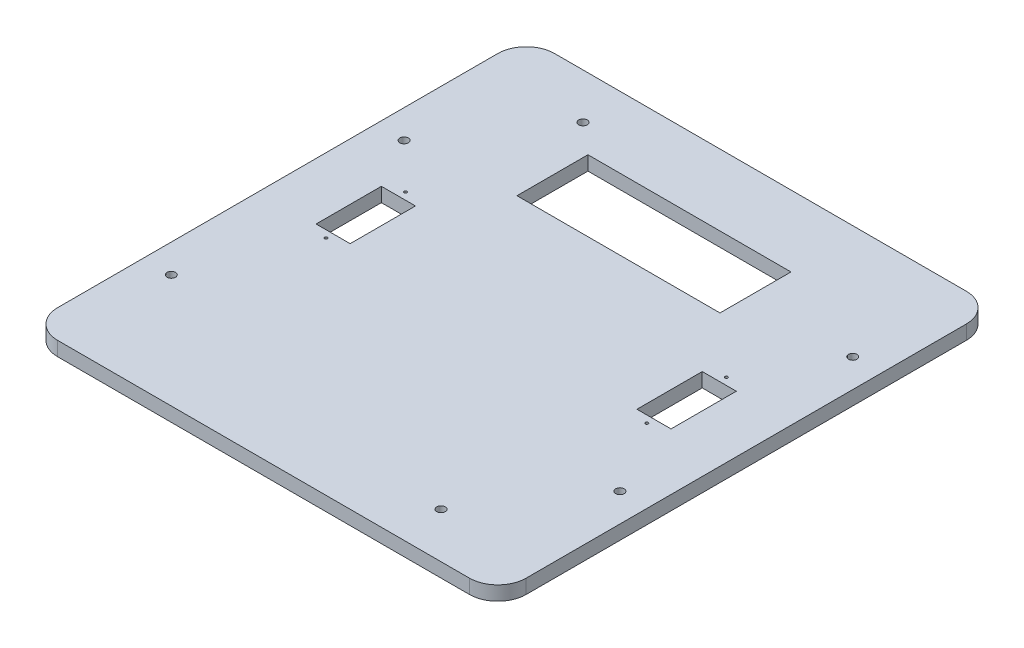
ISO-10303-21;
HEADER;
FILE_DESCRIPTION(('STEP AP214'),'2;1');
FILE_NAME('part.step','',(''),(''),'','','');
FILE_SCHEMA(('AUTOMOTIVE_DESIGN { 1 0 10303 214 1 1 1 1 }'));
ENDSEC;
DATA;
#1=APPLICATION_CONTEXT('core data for automotive mechanical design processes');
#2=APPLICATION_PROTOCOL_DEFINITION('international standard','automotive_design',2000,#1);
#3=PRODUCT_CONTEXT('',#1,'mechanical');
#4=PRODUCT('Part','Part','',(#3));
#5=PRODUCT_RELATED_PRODUCT_CATEGORY('part','',(#4));
#6=PRODUCT_DEFINITION_FORMATION('','',#4);
#7=PRODUCT_DEFINITION_CONTEXT('part definition',#1,'design');
#8=PRODUCT_DEFINITION('design','',#6,#7);
#9=PRODUCT_DEFINITION_SHAPE('','',#8);
#10=(LENGTH_UNIT() NAMED_UNIT(*) SI_UNIT(.MILLI.,.METRE.));
#11=(NAMED_UNIT(*) PLANE_ANGLE_UNIT() SI_UNIT($,.RADIAN.));
#12=(NAMED_UNIT(*) SI_UNIT($,.STERADIAN.) SOLID_ANGLE_UNIT());
#13=UNCERTAINTY_MEASURE_WITH_UNIT(LENGTH_MEASURE(1.E-05),#10,'distance_accuracy_value','');
#14=(GEOMETRIC_REPRESENTATION_CONTEXT(3) GLOBAL_UNCERTAINTY_ASSIGNED_CONTEXT((#13)) GLOBAL_UNIT_ASSIGNED_CONTEXT((#10,
#11,#12)) REPRESENTATION_CONTEXT('',''));
#15=CARTESIAN_POINT('',(0.,0.,0.));
#16=DIRECTION('',(0.,0.,1.));
#17=DIRECTION('',(1.,0.,0.));
#18=AXIS2_PLACEMENT_3D('',#15,#16,#17);
#19=CARTESIAN_POINT('',(0.,5.,-142.264378700801));
#20=DIRECTION('',(0.,0.,-1.));
#21=DIRECTION('',(-1.,0.,0.));
#22=AXIS2_PLACEMENT_3D('',#19,#20,#21);
#23=PLANE('',#22);
#24=DIRECTION('',(1.,0.,0.));
#25=VECTOR('',#24,1.);
#26=CARTESIAN_POINT('',(0.,0.,-142.264378700801));
#27=LINE('',#26,#25);
#28=CARTESIAN_POINT('',(-25.4635897407987,0.,-142.264378700801));
#29=VERTEX_POINT('',#28);
#30=CARTESIAN_POINT('',(119.536410259201,0.,-142.264378700801));
#31=VERTEX_POINT('',#30);
#32=EDGE_CURVE('E318',#29,#31,#27,.T.);
#33=ORIENTED_EDGE('',*,*,#32,.F.);
#34=DIRECTION('',(0.,-1.,0.));
#35=VECTOR('',#34,1.);
#36=CARTESIAN_POINT('',(-25.4635897407987,5.,-142.264378700801));
#37=LINE('',#36,#35);
#38=CARTESIAN_POINT('',(-25.4635897407987,5.,-142.264378700801));
#39=VERTEX_POINT('',#38);
#40=EDGE_CURVE('E11',#39,#29,#37,.T.);
#41=ORIENTED_EDGE('',*,*,#40,.F.);
#42=DIRECTION('',(1.,0.,0.));
#43=VECTOR('',#42,1.);
#44=CARTESIAN_POINT('',(0.,5.,-142.264378700801));
#45=LINE('',#44,#43);
#46=CARTESIAN_POINT('',(119.536410259201,5.,-142.264378700801));
#47=VERTEX_POINT('',#46);
#48=EDGE_CURVE('E321',#39,#47,#45,.T.);
#49=ORIENTED_EDGE('',*,*,#48,.T.);
#50=DIRECTION('',(0.,-1.,0.));
#51=VECTOR('',#50,1.);
#52=CARTESIAN_POINT('',(119.536410259201,5.,-142.264378700801));
#53=LINE('',#52,#51);
#54=EDGE_CURVE('E341',#47,#31,#53,.T.);
#55=ORIENTED_EDGE('',*,*,#54,.T.);
#56=EDGE_LOOP('',(#33,#41,#49,#55));
#57=FACE_BOUND('',#56,.T.);
#58=ADVANCED_FACE('F33',(#57),#23,.T.);
#59=CARTESIAN_POINT('',(-25.4635897407988,5.,-132.264378700801));
#60=DIRECTION('',(0.,-1.,0.));
#61=DIRECTION('',(0.,0.,-1.));
#62=AXIS2_PLACEMENT_3D('',#59,#60,#61);
#63=CYLINDRICAL_SURFACE('',#62,10.);
#64=CARTESIAN_POINT('',(-25.4635897407988,0.,-132.264378700801));
#65=DIRECTION('',(0.,1.,0.));
#66=DIRECTION('',(0.,0.,1.));
#67=AXIS2_PLACEMENT_3D('',#64,#65,#66);
#68=CIRCLE('',#67,10.);
#69=CARTESIAN_POINT('',(-35.4635897407988,0.,-132.264378700801));
#70=VERTEX_POINT('',#69);
#71=EDGE_CURVE('E344',#29,#70,#68,.T.);
#72=ORIENTED_EDGE('',*,*,#71,.T.);
#73=DIRECTION('',(0.,-1.,0.));
#74=VECTOR('',#73,1.);
#75=CARTESIAN_POINT('',(-35.4635897407988,5.,-132.264378700801));
#76=LINE('',#75,#74);
#77=CARTESIAN_POINT('',(-35.4635897407988,5.,-132.264378700801));
#78=VERTEX_POINT('',#77);
#79=EDGE_CURVE('E40',#78,#70,#76,.T.);
#80=ORIENTED_EDGE('',*,*,#79,.F.);
#81=CARTESIAN_POINT('',(-25.4635897407988,5.,-132.264378700801));
#82=DIRECTION('',(0.,1.,0.));
#83=DIRECTION('',(0.,0.,1.));
#84=AXIS2_PLACEMENT_3D('',#81,#82,#83);
#85=CIRCLE('',#84,10.);
#86=EDGE_CURVE('E324',#39,#78,#85,.T.);
#87=ORIENTED_EDGE('',*,*,#86,.F.);
#88=ORIENTED_EDGE('',*,*,#40,.T.);
#89=EDGE_LOOP('',(#72,#80,#87,#88));
#90=FACE_BOUND('',#89,.T.);
#91=ADVANCED_FACE('F403',(#90),#63,.T.);
#92=CARTESIAN_POINT('',(-35.4635897407988,5.,0.));
#93=DIRECTION('',(1.,0.,0.));
#94=DIRECTION('',(0.,0.,-1.));
#95=AXIS2_PLACEMENT_3D('',#92,#93,#94);
#96=PLANE('',#95);
#97=DIRECTION('',(0.,0.,1.));
#98=VECTOR('',#97,1.);
#99=CARTESIAN_POINT('',(-35.4635897407988,0.,0.));
#100=LINE('',#99,#98);
#101=CARTESIAN_POINT('',(-35.4635897407988,0.,22.7356212991988));
#102=VERTEX_POINT('',#101);
#103=EDGE_CURVE('E346',#70,#102,#100,.T.);
#104=ORIENTED_EDGE('',*,*,#103,.T.);
#105=DIRECTION('',(0.,-1.,0.));
#106=VECTOR('',#105,1.);
#107=CARTESIAN_POINT('',(-35.4635897407988,5.,22.7356212991988));
#108=LINE('',#107,#106);
#109=CARTESIAN_POINT('',(-35.4635897407988,5.,22.7356212991988));
#110=VERTEX_POINT('',#109);
#111=EDGE_CURVE('E371',#110,#102,#108,.T.);
#112=ORIENTED_EDGE('',*,*,#111,.F.);
#113=DIRECTION('',(0.,0.,1.));
#114=VECTOR('',#113,1.);
#115=CARTESIAN_POINT('',(-35.4635897407988,5.,0.));
#116=LINE('',#115,#114);
#117=EDGE_CURVE('E327',#78,#110,#116,.T.);
#118=ORIENTED_EDGE('',*,*,#117,.F.);
#119=ORIENTED_EDGE('',*,*,#79,.T.);
#120=EDGE_LOOP('',(#104,#112,#118,#119));
#121=FACE_BOUND('',#120,.T.);
#122=ADVANCED_FACE('F378',(#121),#96,.F.);
#123=CARTESIAN_POINT('',(-25.4635897407988,5.,22.7356212991989));
#124=DIRECTION('',(0.,-1.,0.));
#125=DIRECTION('',(0.,0.,-1.));
#126=AXIS2_PLACEMENT_3D('',#123,#124,#125);
#127=CYLINDRICAL_SURFACE('',#126,10.);
#128=CARTESIAN_POINT('',(-25.4635897407988,0.,22.7356212991989));
#129=DIRECTION('',(0.,1.,0.));
#130=DIRECTION('',(0.,0.,1.));
#131=AXIS2_PLACEMENT_3D('',#128,#129,#130);
#132=CIRCLE('',#131,10.);
#133=CARTESIAN_POINT('',(-25.4635897407987,0.,32.7356212991989));
#134=VERTEX_POINT('',#133);
#135=EDGE_CURVE('E348',#102,#134,#132,.T.);
#136=ORIENTED_EDGE('',*,*,#135,.T.);
#137=DIRECTION('',(0.,-1.,0.));
#138=VECTOR('',#137,1.);
#139=CARTESIAN_POINT('',(-25.4635897407987,5.,32.7356212991989));
#140=LINE('',#139,#138);
#141=CARTESIAN_POINT('',(-25.4635897407987,5.,32.7356212991989));
#142=VERTEX_POINT('',#141);
#143=EDGE_CURVE('E368',#142,#134,#140,.T.);
#144=ORIENTED_EDGE('',*,*,#143,.F.);
#145=CARTESIAN_POINT('',(-25.4635897407988,5.,22.7356212991989));
#146=DIRECTION('',(0.,1.,0.));
#147=DIRECTION('',(0.,0.,1.));
#148=AXIS2_PLACEMENT_3D('',#145,#146,#147);
#149=CIRCLE('',#148,10.);
#150=EDGE_CURVE('E329',#110,#142,#149,.T.);
#151=ORIENTED_EDGE('',*,*,#150,.F.);
#152=ORIENTED_EDGE('',*,*,#111,.T.);
#153=EDGE_LOOP('',(#136,#144,#151,#152));
#154=FACE_BOUND('',#153,.T.);
#155=ADVANCED_FACE('F390',(#154),#127,.T.);
#156=CARTESIAN_POINT('',(0.,5.,32.7356212991989));
#157=DIRECTION('',(0.,0.,-1.));
#158=DIRECTION('',(-1.,0.,0.));
#159=AXIS2_PLACEMENT_3D('',#156,#157,#158);
#160=PLANE('',#159);
#161=DIRECTION('',(1.,0.,0.));
#162=VECTOR('',#161,1.);
#163=CARTESIAN_POINT('',(0.,0.,32.7356212991989));
#164=LINE('',#163,#162);
#165=CARTESIAN_POINT('',(119.536410259201,0.,32.7356212991989));
#166=VERTEX_POINT('',#165);
#167=EDGE_CURVE('E350',#134,#166,#164,.T.);
#168=ORIENTED_EDGE('',*,*,#167,.T.);
#169=DIRECTION('',(0.,-1.,0.));
#170=VECTOR('',#169,1.);
#171=CARTESIAN_POINT('',(119.536410259201,5.,32.7356212991989));
#172=LINE('',#171,#170);
#173=CARTESIAN_POINT('',(119.536410259201,5.,32.7356212991989));
#174=VERTEX_POINT('',#173);
#175=EDGE_CURVE('E365',#174,#166,#172,.T.);
#176=ORIENTED_EDGE('',*,*,#175,.F.);
#177=DIRECTION('',(1.,0.,0.));
#178=VECTOR('',#177,1.);
#179=CARTESIAN_POINT('',(0.,5.,32.7356212991989));
#180=LINE('',#179,#178);
#181=EDGE_CURVE('E331',#142,#174,#180,.T.);
#182=ORIENTED_EDGE('',*,*,#181,.F.);
#183=ORIENTED_EDGE('',*,*,#143,.T.);
#184=EDGE_LOOP('',(#168,#176,#182,#183));
#185=FACE_BOUND('',#184,.T.);
#186=ADVANCED_FACE('F394',(#185),#160,.F.);
#187=CARTESIAN_POINT('',(119.536410259201,5.,22.7356212991989));
#188=DIRECTION('',(0.,-1.,0.));
#189=DIRECTION('',(0.,0.,-1.));
#190=AXIS2_PLACEMENT_3D('',#187,#188,#189);
#191=CYLINDRICAL_SURFACE('',#190,10.);
#192=CARTESIAN_POINT('',(119.536410259201,0.,22.7356212991989));
#193=DIRECTION('',(0.,1.,0.));
#194=DIRECTION('',(0.,0.,1.));
#195=AXIS2_PLACEMENT_3D('',#192,#193,#194);
#196=CIRCLE('',#195,10.);
#197=CARTESIAN_POINT('',(129.536410259201,0.,22.7356212991988));
#198=VERTEX_POINT('',#197);
#199=EDGE_CURVE('E352',#166,#198,#196,.T.);
#200=ORIENTED_EDGE('',*,*,#199,.T.);
#201=DIRECTION('',(0.,-1.,0.));
#202=VECTOR('',#201,1.);
#203=CARTESIAN_POINT('',(129.536410259201,5.,22.7356212991988));
#204=LINE('',#203,#202);
#205=CARTESIAN_POINT('',(129.536410259201,5.,22.7356212991988));
#206=VERTEX_POINT('',#205);
#207=EDGE_CURVE('E363',#206,#198,#204,.T.);
#208=ORIENTED_EDGE('',*,*,#207,.F.);
#209=CARTESIAN_POINT('',(119.536410259201,5.,22.7356212991989));
#210=DIRECTION('',(0.,1.,0.));
#211=DIRECTION('',(0.,0.,1.));
#212=AXIS2_PLACEMENT_3D('',#209,#210,#211);
#213=CIRCLE('',#212,10.);
#214=EDGE_CURVE('E333',#174,#206,#213,.T.);
#215=ORIENTED_EDGE('',*,*,#214,.F.);
#216=ORIENTED_EDGE('',*,*,#175,.T.);
#217=EDGE_LOOP('',(#200,#208,#215,#216));
#218=FACE_BOUND('',#217,.T.);
#219=ADVANCED_FACE('F412',(#218),#191,.T.);
#220=CARTESIAN_POINT('',(129.536410259201,5.,0.));
#221=DIRECTION('',(1.,0.,0.));
#222=DIRECTION('',(0.,0.,-1.));
#223=AXIS2_PLACEMENT_3D('',#220,#221,#222);
#224=PLANE('',#223);
#225=DIRECTION('',(0.,0.,1.));
#226=VECTOR('',#225,1.);
#227=CARTESIAN_POINT('',(129.536410259201,0.,0.));
#228=LINE('',#227,#226);
#229=CARTESIAN_POINT('',(129.536410259201,0.,-132.264378700801));
#230=VERTEX_POINT('',#229);
#231=EDGE_CURVE('E355',#230,#198,#228,.T.);
#232=ORIENTED_EDGE('',*,*,#231,.F.);
#233=DIRECTION('',(0.,-1.,0.));
#234=VECTOR('',#233,1.);
#235=CARTESIAN_POINT('',(129.536410259201,5.,-132.264378700801));
#236=LINE('',#235,#234);
#237=CARTESIAN_POINT('',(129.536410259201,5.,-132.264378700801));
#238=VERTEX_POINT('',#237);
#239=EDGE_CURVE('E361',#238,#230,#236,.T.);
#240=ORIENTED_EDGE('',*,*,#239,.F.);
#241=DIRECTION('',(0.,0.,1.));
#242=VECTOR('',#241,1.);
#243=CARTESIAN_POINT('',(129.536410259201,5.,0.));
#244=LINE('',#243,#242);
#245=EDGE_CURVE('E335',#238,#206,#244,.T.);
#246=ORIENTED_EDGE('',*,*,#245,.T.);
#247=ORIENTED_EDGE('',*,*,#207,.T.);
#248=EDGE_LOOP('',(#232,#240,#246,#247));
#249=FACE_BOUND('',#248,.T.);
#250=ADVANCED_FACE('F410',(#249),#224,.T.);
#251=CARTESIAN_POINT('',(119.536410259201,5.,-132.264378700801));
#252=DIRECTION('',(0.,-1.,0.));
#253=DIRECTION('',(0.,0.,-1.));
#254=AXIS2_PLACEMENT_3D('',#251,#252,#253);
#255=CYLINDRICAL_SURFACE('',#254,10.);
#256=CARTESIAN_POINT('',(119.536410259201,0.,-132.264378700801));
#257=DIRECTION('',(0.,1.,0.));
#258=DIRECTION('',(0.,0.,1.));
#259=AXIS2_PLACEMENT_3D('',#256,#257,#258);
#260=CIRCLE('',#259,10.);
#261=EDGE_CURVE('E325',#31,#230,#260,.F.);
#262=ORIENTED_EDGE('',*,*,#261,.F.);
#263=ORIENTED_EDGE('',*,*,#54,.F.);
#264=CARTESIAN_POINT('',(119.536410259201,5.,-132.264378700801));
#265=DIRECTION('',(0.,1.,0.));
#266=DIRECTION('',(0.,0.,1.));
#267=AXIS2_PLACEMENT_3D('',#264,#265,#266);
#268=CIRCLE('',#267,10.);
#269=EDGE_CURVE('E338',#47,#238,#268,.F.);
#270=ORIENTED_EDGE('',*,*,#269,.T.);
#271=ORIENTED_EDGE('',*,*,#239,.T.);
#272=EDGE_LOOP('',(#262,#263,#270,#271));
#273=FACE_BOUND('',#272,.T.);
#274=ADVANCED_FACE('F407',(#273),#255,.T.);
#275=CARTESIAN_POINT('',(0.,5.,0.));
#276=DIRECTION('',(0.,1.,0.));
#277=DIRECTION('',(0.,0.,1.));
#278=AXIS2_PLACEMENT_3D('',#275,#276,#277);
#279=PLANE('',#278);
#280=CARTESIAN_POINT('',(-25.4635897407988,5.,-89.2643787008011));
#281=DIRECTION('',(0.,1.,0.));
#282=DIRECTION('',(0.,0.,1.));
#283=AXIS2_PLACEMENT_3D('',#280,#281,#282);
#284=CIRCLE('',#283,1.5);
#285=CARTESIAN_POINT('',(-25.4635897407988,5.,-87.7643787008011));
#286=VERTEX_POINT('',#285);
#287=EDGE_CURVE('E700',#286,#286,#284,.T.);
#288=ORIENTED_EDGE('',*,*,#287,.F.);
#289=EDGE_LOOP('',(#288));
#290=FACE_BOUND('',#289,.T.);
#291=CARTESIAN_POINT('',(119.536410259201,5.,-20.2643787008011));
#292=DIRECTION('',(0.,1.,0.));
#293=DIRECTION('',(0.,0.,1.));
#294=AXIS2_PLACEMENT_3D('',#291,#292,#293);
#295=CIRCLE('',#294,1.5);
#296=CARTESIAN_POINT('',(119.536410259201,5.,-18.7643787008011));
#297=VERTEX_POINT('',#296);
#298=EDGE_CURVE('E192',#297,#297,#295,.T.);
#299=ORIENTED_EDGE('',*,*,#298,.F.);
#300=EDGE_LOOP('',(#299));
#301=FACE_BOUND('',#300,.T.);
#302=DIRECTION('',(0.,0.,1.));
#303=VECTOR('',#302,1.);
#304=CARTESIAN_POINT('',(11.2864102592012,5.,-92.2643787008011));
#305=LINE('',#304,#303);
#306=CARTESIAN_POINT('',(11.2864102592012,5.,-117.264378700801));
#307=VERTEX_POINT('',#306);
#308=CARTESIAN_POINT('',(11.2864102592012,5.,-92.2643787008011));
#309=VERTEX_POINT('',#308);
#310=EDGE_CURVE('E47',#307,#309,#305,.T.);
#311=ORIENTED_EDGE('',*,*,#310,.F.);
#312=DIRECTION('',(-1.,0.,0.));
#313=VECTOR('',#312,1.);
#314=CARTESIAN_POINT('',(11.2864102592012,5.,-117.264378700801));
#315=LINE('',#314,#313);
#316=CARTESIAN_POINT('',(82.7864102592012,5.,-117.264378700801));
#317=VERTEX_POINT('',#316);
#318=EDGE_CURVE('E186',#317,#307,#315,.T.);
#319=ORIENTED_EDGE('',*,*,#318,.F.);
#320=DIRECTION('',(0.,0.,-1.));
#321=VECTOR('',#320,1.);
#322=CARTESIAN_POINT('',(82.7864102592012,5.,-92.2643787008011));
#323=LINE('',#322,#321);
#324=CARTESIAN_POINT('',(82.7864102592012,5.,-92.2643787008011));
#325=VERTEX_POINT('',#324);
#326=EDGE_CURVE('E189',#325,#317,#323,.T.);
#327=ORIENTED_EDGE('',*,*,#326,.F.);
#328=DIRECTION('',(1.,0.,0.));
#329=VECTOR('',#328,1.);
#330=CARTESIAN_POINT('',(11.2864102592012,5.,-92.2643787008011));
#331=LINE('',#330,#329);
#332=EDGE_CURVE('E198',#309,#325,#331,.T.);
#333=ORIENTED_EDGE('',*,*,#332,.F.);
#334=EDGE_LOOP('',(#311,#319,#327,#333));
#335=FACE_BOUND('',#334,.T.);
#336=DIRECTION('',(0.,0.,1.));
#337=VECTOR('',#336,1.);
#338=CARTESIAN_POINT('',(-15.4635897407988,5.,-48.2643787008011));
#339=LINE('',#338,#337);
#340=CARTESIAN_POINT('',(-15.4635897407988,5.,-71.2643787008011));
#341=VERTEX_POINT('',#340);
#342=CARTESIAN_POINT('',(-15.4635897407988,5.,-48.2643787008011));
#343=VERTEX_POINT('',#342);
#344=EDGE_CURVE('E205',#341,#343,#339,.T.);
#345=ORIENTED_EDGE('',*,*,#344,.F.);
#346=DIRECTION('',(-1.,0.,0.));
#347=VECTOR('',#346,1.);
#348=CARTESIAN_POINT('',(-15.4635897407988,5.,-71.2643787008011));
#349=LINE('',#348,#347);
#350=CARTESIAN_POINT('',(-3.46358974079879,5.,-71.2643787008011));
#351=VERTEX_POINT('',#350);
#352=EDGE_CURVE('E253',#351,#341,#349,.T.);
#353=ORIENTED_EDGE('',*,*,#352,.F.);
#354=DIRECTION('',(0.,0.,-1.));
#355=VECTOR('',#354,1.);
#356=CARTESIAN_POINT('',(-3.46358974079879,5.,-48.2643787008011));
#357=LINE('',#356,#355);
#358=CARTESIAN_POINT('',(-3.46358974079879,5.,-48.2643787008011));
#359=VERTEX_POINT('',#358);
#360=EDGE_CURVE('E267',#359,#351,#357,.T.);
#361=ORIENTED_EDGE('',*,*,#360,.F.);
#362=DIRECTION('',(1.,0.,0.));
#363=VECTOR('',#362,1.);
#364=CARTESIAN_POINT('',(-15.4635897407988,5.,-48.2643787008011));
#365=LINE('',#364,#363);
#366=EDGE_CURVE('E264',#343,#359,#365,.T.);
#367=ORIENTED_EDGE('',*,*,#366,.F.);
#368=EDGE_LOOP('',(#345,#353,#361,#367));
#369=FACE_BOUND('',#368,.T.);
#370=DIRECTION('',(0.,0.,-1.));
#371=VECTOR('',#370,1.);
#372=CARTESIAN_POINT('',(109.536410259201,5.,-48.2643787008011));
#373=LINE('',#372,#371);
#374=CARTESIAN_POINT('',(109.536410259201,5.,-48.2643787008011));
#375=VERTEX_POINT('',#374);
#376=CARTESIAN_POINT('',(109.536410259201,5.,-71.2643787008011));
#377=VERTEX_POINT('',#376);
#378=EDGE_CURVE('E231',#375,#377,#373,.T.);
#379=ORIENTED_EDGE('',*,*,#378,.F.);
#380=DIRECTION('',(1.,0.,0.));
#381=VECTOR('',#380,1.);
#382=CARTESIAN_POINT('',(109.536410259201,5.,-48.2643787008011));
#383=LINE('',#382,#381);
#384=CARTESIAN_POINT('',(97.5364102592012,5.,-48.2643787008011));
#385=VERTEX_POINT('',#384);
#386=EDGE_CURVE('E221',#385,#375,#383,.T.);
#387=ORIENTED_EDGE('',*,*,#386,.F.);
#388=DIRECTION('',(0.,0.,1.));
#389=VECTOR('',#388,1.);
#390=CARTESIAN_POINT('',(97.5364102592012,5.,-48.2643787008011));
#391=LINE('',#390,#389);
#392=CARTESIAN_POINT('',(97.5364102592012,5.,-71.2643787008011));
#393=VERTEX_POINT('',#392);
#394=EDGE_CURVE('E237',#393,#385,#391,.T.);
#395=ORIENTED_EDGE('',*,*,#394,.F.);
#396=DIRECTION('',(-1.,0.,0.));
#397=VECTOR('',#396,1.);
#398=CARTESIAN_POINT('',(109.536410259201,5.,-71.2643787008011));
#399=LINE('',#398,#397);
#400=EDGE_CURVE('E233',#377,#393,#399,.T.);
#401=ORIENTED_EDGE('',*,*,#400,.F.);
#402=EDGE_LOOP('',(#379,#387,#395,#401));
#403=FACE_BOUND('',#402,.T.);
#404=CARTESIAN_POINT('',(103.536410259201,5.,-73.7643787008011));
#405=DIRECTION('',(0.,1.,0.));
#406=DIRECTION('',(0.,0.,1.));
#407=AXIS2_PLACEMENT_3D('',#404,#405,#406);
#408=CIRCLE('',#407,0.499999999999999);
#409=CARTESIAN_POINT('',(103.536410259201,5.,-73.2643787008011));
#410=VERTEX_POINT('',#409);
#411=EDGE_CURVE('E213',#410,#410,#408,.T.);
#412=ORIENTED_EDGE('',*,*,#411,.F.);
#413=EDGE_LOOP('',(#412));
#414=FACE_BOUND('',#413,.T.);
#415=CARTESIAN_POINT('',(103.536410259201,5.,-45.7643787008011));
#416=DIRECTION('',(0.,1.,0.));
#417=DIRECTION('',(0.,0.,1.));
#418=AXIS2_PLACEMENT_3D('',#415,#416,#417);
#419=CIRCLE('',#418,0.499999999999999);
#420=CARTESIAN_POINT('',(103.536410259201,5.,-45.2643787008011));
#421=VERTEX_POINT('',#420);
#422=EDGE_CURVE('E212',#421,#421,#419,.T.);
#423=ORIENTED_EDGE('',*,*,#422,.F.);
#424=EDGE_LOOP('',(#423));
#425=FACE_BOUND('',#424,.T.);
#426=CARTESIAN_POINT('',(-9.46358974079879,5.,-73.7643787008011));
#427=DIRECTION('',(0.,1.,0.));
#428=DIRECTION('',(0.,0.,1.));
#429=AXIS2_PLACEMENT_3D('',#426,#427,#428);
#430=CIRCLE('',#429,0.499999999999999);
#431=CARTESIAN_POINT('',(-9.46358974079879,5.,-73.2643787008011));
#432=VERTEX_POINT('',#431);
#433=EDGE_CURVE('E283',#432,#432,#430,.T.);
#434=ORIENTED_EDGE('',*,*,#433,.F.);
#435=EDGE_LOOP('',(#434));
#436=FACE_BOUND('',#435,.T.);
#437=CARTESIAN_POINT('',(-9.46358974079879,5.,-45.7643787008011));
#438=DIRECTION('',(0.,1.,0.));
#439=DIRECTION('',(0.,0.,1.));
#440=AXIS2_PLACEMENT_3D('',#437,#438,#439);
#441=CIRCLE('',#440,0.499999999999999);
#442=CARTESIAN_POINT('',(-9.46358974079879,5.,-45.2643787008011));
#443=VERTEX_POINT('',#442);
#444=EDGE_CURVE('E282',#443,#443,#441,.T.);
#445=ORIENTED_EDGE('',*,*,#444,.F.);
#446=EDGE_LOOP('',(#445));
#447=FACE_BOUND('',#446,.T.);
#448=CARTESIAN_POINT('',(0.53641025920121,5.,-126.264378700801));
#449=DIRECTION('',(0.,1.,0.));
#450=DIRECTION('',(0.,0.,1.));
#451=AXIS2_PLACEMENT_3D('',#448,#449,#450);
#452=CIRCLE('',#451,1.5);
#453=CARTESIAN_POINT('',(0.53641025920121,5.,-124.764378700801));
#454=VERTEX_POINT('',#453);
#455=EDGE_CURVE('E301',#454,#454,#452,.T.);
#456=ORIENTED_EDGE('',*,*,#455,.F.);
#457=EDGE_LOOP('',(#456));
#458=FACE_BOUND('',#457,.T.);
#459=CARTESIAN_POINT('',(119.536410259201,5.,-102.264378700801));
#460=DIRECTION('',(0.,1.,0.));
#461=DIRECTION('',(0.,0.,1.));
#462=AXIS2_PLACEMENT_3D('',#459,#460,#461);
#463=CIRCLE('',#462,1.5);
#464=CARTESIAN_POINT('',(119.536410259201,5.,-100.764378700801));
#465=VERTEX_POINT('',#464);
#466=EDGE_CURVE('E307',#465,#465,#463,.T.);
#467=ORIENTED_EDGE('',*,*,#466,.F.);
#468=EDGE_LOOP('',(#467));
#469=FACE_BOUND('',#468,.T.);
#470=CARTESIAN_POINT('',(93.5364102592012,5.,16.7356212991989));
#471=DIRECTION('',(0.,1.,0.));
#472=DIRECTION('',(0.,0.,1.));
#473=AXIS2_PLACEMENT_3D('',#470,#471,#472);
#474=CIRCLE('',#473,1.5);
#475=CARTESIAN_POINT('',(93.5364102592012,5.,18.2356212991989));
#476=VERTEX_POINT('',#475);
#477=EDGE_CURVE('E294',#476,#476,#474,.T.);
#478=ORIENTED_EDGE('',*,*,#477,.F.);
#479=EDGE_LOOP('',(#478));
#480=FACE_BOUND('',#479,.T.);
#481=CARTESIAN_POINT('',(-25.4635897407988,5.,-7.2643787008011));
#482=DIRECTION('',(0.,1.,0.));
#483=DIRECTION('',(0.,0.,1.));
#484=AXIS2_PLACEMENT_3D('',#481,#482,#483);
#485=CIRCLE('',#484,1.5);
#486=CARTESIAN_POINT('',(-25.4635897407988,5.,-5.7643787008011));
#487=VERTEX_POINT('',#486);
#488=EDGE_CURVE('E300',#487,#487,#485,.T.);
#489=ORIENTED_EDGE('',*,*,#488,.F.);
#490=EDGE_LOOP('',(#489));
#491=FACE_BOUND('',#490,.T.);
#492=ORIENTED_EDGE('',*,*,#48,.F.);
#493=ORIENTED_EDGE('',*,*,#86,.T.);
#494=ORIENTED_EDGE('',*,*,#117,.T.);
#495=ORIENTED_EDGE('',*,*,#150,.T.);
#496=ORIENTED_EDGE('',*,*,#181,.T.);
#497=ORIENTED_EDGE('',*,*,#214,.T.);
#498=ORIENTED_EDGE('',*,*,#245,.F.);
#499=ORIENTED_EDGE('',*,*,#269,.F.);
#500=EDGE_LOOP('',(#492,#493,#494,#495,#496,#497,#498,#499));
#501=FACE_BOUND('',#500,.T.);
#502=ADVANCED_FACE('F399',(#290,#301,#335,#369,#403,#414,#425,#436,#447,#458,#469,#480,#491,
#501),#279,.T.);
#503=CARTESIAN_POINT('',(0.,0.,0.));
#504=DIRECTION('',(0.,1.,0.));
#505=DIRECTION('',(0.,0.,1.));
#506=AXIS2_PLACEMENT_3D('',#503,#504,#505);
#507=PLANE('',#506);
#508=CARTESIAN_POINT('',(-25.4635897407988,0.,-89.2643787008011));
#509=DIRECTION('',(0.,1.,0.));
#510=DIRECTION('',(0.,0.,1.));
#511=AXIS2_PLACEMENT_3D('',#508,#509,#510);
#512=CIRCLE('',#511,1.5);
#513=CARTESIAN_POINT('',(-25.4635897407988,0.,-87.7643787008011));
#514=VERTEX_POINT('',#513);
#515=EDGE_CURVE('E199',#514,#514,#512,.T.);
#516=ORIENTED_EDGE('',*,*,#515,.T.);
#517=EDGE_LOOP('',(#516));
#518=FACE_BOUND('',#517,.T.);
#519=CARTESIAN_POINT('',(119.536410259201,0.,-20.2643787008011));
#520=DIRECTION('',(0.,1.,0.));
#521=DIRECTION('',(0.,0.,1.));
#522=AXIS2_PLACEMENT_3D('',#519,#520,#521);
#523=CIRCLE('',#522,1.5);
#524=CARTESIAN_POINT('',(119.536410259201,0.,-18.7643787008011));
#525=VERTEX_POINT('',#524);
#526=EDGE_CURVE('E701',#525,#525,#523,.T.);
#527=ORIENTED_EDGE('',*,*,#526,.T.);
#528=EDGE_LOOP('',(#527));
#529=FACE_BOUND('',#528,.T.);
#530=DIRECTION('',(-1.,0.,0.));
#531=VECTOR('',#530,1.);
#532=CARTESIAN_POINT('',(11.2864102592012,0.,-117.264378700801));
#533=LINE('',#532,#531);
#534=CARTESIAN_POINT('',(82.7864102592012,0.,-117.264378700801));
#535=VERTEX_POINT('',#534);
#536=CARTESIAN_POINT('',(11.2864102592012,0.,-117.264378700801));
#537=VERTEX_POINT('',#536);
#538=EDGE_CURVE('E176',#535,#537,#533,.T.);
#539=ORIENTED_EDGE('',*,*,#538,.T.);
#540=DIRECTION('',(0.,0.,1.));
#541=VECTOR('',#540,1.);
#542=CARTESIAN_POINT('',(11.2864102592012,0.,-92.2643787008011));
#543=LINE('',#542,#541);
#544=CARTESIAN_POINT('',(11.2864102592012,0.,-92.2643787008011));
#545=VERTEX_POINT('',#544);
#546=EDGE_CURVE('E170',#537,#545,#543,.T.);
#547=ORIENTED_EDGE('',*,*,#546,.T.);
#548=DIRECTION('',(1.,0.,0.));
#549=VECTOR('',#548,1.);
#550=CARTESIAN_POINT('',(11.2864102592012,0.,-92.2643787008011));
#551=LINE('',#550,#549);
#552=CARTESIAN_POINT('',(82.7864102592012,0.,-92.2643787008011));
#553=VERTEX_POINT('',#552);
#554=EDGE_CURVE('E179',#545,#553,#551,.T.);
#555=ORIENTED_EDGE('',*,*,#554,.T.);
#556=DIRECTION('',(0.,0.,-1.));
#557=VECTOR('',#556,1.);
#558=CARTESIAN_POINT('',(82.7864102592012,0.,-92.2643787008011));
#559=LINE('',#558,#557);
#560=EDGE_CURVE('E55',#553,#535,#559,.T.);
#561=ORIENTED_EDGE('',*,*,#560,.T.);
#562=EDGE_LOOP('',(#539,#547,#555,#561));
#563=FACE_BOUND('',#562,.T.);
#564=DIRECTION('',(-1.,0.,0.));
#565=VECTOR('',#564,1.);
#566=CARTESIAN_POINT('',(-15.4635897407988,0.,-71.2643787008011));
#567=LINE('',#566,#565);
#568=CARTESIAN_POINT('',(-3.46358974079879,0.,-71.2643787008011));
#569=VERTEX_POINT('',#568);
#570=CARTESIAN_POINT('',(-15.4635897407988,0.,-71.2643787008011));
#571=VERTEX_POINT('',#570);
#572=EDGE_CURVE('E259',#569,#571,#567,.T.);
#573=ORIENTED_EDGE('',*,*,#572,.T.);
#574=DIRECTION('',(0.,0.,1.));
#575=VECTOR('',#574,1.);
#576=CARTESIAN_POINT('',(-15.4635897407988,0.,-48.2643787008011));
#577=LINE('',#576,#575);
#578=CARTESIAN_POINT('',(-15.4635897407988,0.,-48.2643787008011));
#579=VERTEX_POINT('',#578);
#580=EDGE_CURVE('E249',#571,#579,#577,.T.);
#581=ORIENTED_EDGE('',*,*,#580,.T.);
#582=DIRECTION('',(1.,0.,0.));
#583=VECTOR('',#582,1.);
#584=CARTESIAN_POINT('',(-15.4635897407988,0.,-48.2643787008011));
#585=LINE('',#584,#583);
#586=CARTESIAN_POINT('',(-3.46358974079879,0.,-48.2643787008011));
#587=VERTEX_POINT('',#586);
#588=EDGE_CURVE('E252',#579,#587,#585,.T.);
#589=ORIENTED_EDGE('',*,*,#588,.T.);
#590=DIRECTION('',(0.,0.,-1.));
#591=VECTOR('',#590,1.);
#592=CARTESIAN_POINT('',(-3.46358974079879,0.,-48.2643787008011));
#593=LINE('',#592,#591);
#594=EDGE_CURVE('E256',#587,#569,#593,.T.);
#595=ORIENTED_EDGE('',*,*,#594,.T.);
#596=EDGE_LOOP('',(#573,#581,#589,#595));
#597=FACE_BOUND('',#596,.T.);
#598=DIRECTION('',(1.,0.,0.));
#599=VECTOR('',#598,1.);
#600=CARTESIAN_POINT('',(109.536410259201,0.,-48.2643787008011));
#601=LINE('',#600,#599);
#602=CARTESIAN_POINT('',(97.5364102592012,0.,-48.2643787008011));
#603=VERTEX_POINT('',#602);
#604=CARTESIAN_POINT('',(109.536410259201,0.,-48.2643787008011));
#605=VERTEX_POINT('',#604);
#606=EDGE_CURVE('E227',#603,#605,#601,.T.);
#607=ORIENTED_EDGE('',*,*,#606,.T.);
#608=DIRECTION('',(0.,0.,-1.));
#609=VECTOR('',#608,1.);
#610=CARTESIAN_POINT('',(109.536410259201,0.,-48.2643787008011));
#611=LINE('',#610,#609);
#612=CARTESIAN_POINT('',(109.536410259201,0.,-71.2643787008011));
#613=VERTEX_POINT('',#612);
#614=EDGE_CURVE('E217',#605,#613,#611,.T.);
#615=ORIENTED_EDGE('',*,*,#614,.T.);
#616=DIRECTION('',(-1.,0.,0.));
#617=VECTOR('',#616,1.);
#618=CARTESIAN_POINT('',(109.536410259201,0.,-71.2643787008011));
#619=LINE('',#618,#617);
#620=CARTESIAN_POINT('',(97.5364102592012,0.,-71.2643787008011));
#621=VERTEX_POINT('',#620);
#622=EDGE_CURVE('E220',#613,#621,#619,.T.);
#623=ORIENTED_EDGE('',*,*,#622,.T.);
#624=DIRECTION('',(0.,0.,1.));
#625=VECTOR('',#624,1.);
#626=CARTESIAN_POINT('',(97.5364102592012,0.,-48.2643787008011));
#627=LINE('',#626,#625);
#628=EDGE_CURVE('E224',#621,#603,#627,.T.);
#629=ORIENTED_EDGE('',*,*,#628,.T.);
#630=EDGE_LOOP('',(#607,#615,#623,#629));
#631=FACE_BOUND('',#630,.T.);
#632=CARTESIAN_POINT('',(103.536410259201,0.,-73.7643787008011));
#633=DIRECTION('',(0.,1.,0.));
#634=DIRECTION('',(0.,0.,1.));
#635=AXIS2_PLACEMENT_3D('',#632,#633,#634);
#636=CIRCLE('',#635,0.499999999999999);
#637=CARTESIAN_POINT('',(103.536410259201,0.,-73.2643787008011));
#638=VERTEX_POINT('',#637);
#639=EDGE_CURVE('E209',#638,#638,#636,.T.);
#640=ORIENTED_EDGE('',*,*,#639,.T.);
#641=EDGE_LOOP('',(#640));
#642=FACE_BOUND('',#641,.T.);
#643=CARTESIAN_POINT('',(103.536410259201,0.,-45.7643787008011));
#644=DIRECTION('',(0.,1.,0.));
#645=DIRECTION('',(0.,0.,1.));
#646=AXIS2_PLACEMENT_3D('',#643,#644,#645);
#647=CIRCLE('',#646,0.499999999999999);
#648=CARTESIAN_POINT('',(103.536410259201,0.,-45.2643787008011));
#649=VERTEX_POINT('',#648);
#650=EDGE_CURVE('E286',#649,#649,#647,.T.);
#651=ORIENTED_EDGE('',*,*,#650,.T.);
#652=EDGE_LOOP('',(#651));
#653=FACE_BOUND('',#652,.T.);
#654=CARTESIAN_POINT('',(-9.46358974079879,0.,-73.7643787008011));
#655=DIRECTION('',(0.,1.,0.));
#656=DIRECTION('',(0.,0.,1.));
#657=AXIS2_PLACEMENT_3D('',#654,#655,#656);
#658=CIRCLE('',#657,0.499999999999999);
#659=CARTESIAN_POINT('',(-9.46358974079879,0.,-73.2643787008011));
#660=VERTEX_POINT('',#659);
#661=EDGE_CURVE('E279',#660,#660,#658,.T.);
#662=ORIENTED_EDGE('',*,*,#661,.T.);
#663=EDGE_LOOP('',(#662));
#664=FACE_BOUND('',#663,.T.);
#665=CARTESIAN_POINT('',(-9.46358974079879,0.,-45.7643787008011));
#666=DIRECTION('',(0.,1.,0.));
#667=DIRECTION('',(0.,0.,1.));
#668=AXIS2_PLACEMENT_3D('',#665,#666,#667);
#669=CIRCLE('',#668,0.499999999999999);
#670=CARTESIAN_POINT('',(-9.46358974079879,0.,-45.2643787008011));
#671=VERTEX_POINT('',#670);
#672=EDGE_CURVE('E291',#671,#671,#669,.T.);
#673=ORIENTED_EDGE('',*,*,#672,.T.);
#674=EDGE_LOOP('',(#673));
#675=FACE_BOUND('',#674,.T.);
#676=CARTESIAN_POINT('',(0.53641025920121,0.,-126.264378700801));
#677=DIRECTION('',(0.,1.,0.));
#678=DIRECTION('',(0.,0.,1.));
#679=AXIS2_PLACEMENT_3D('',#676,#677,#678);
#680=CIRCLE('',#679,1.5);
#681=CARTESIAN_POINT('',(0.53641025920121,0.,-124.764378700801));
#682=VERTEX_POINT('',#681);
#683=EDGE_CURVE('E297',#682,#682,#680,.T.);
#684=ORIENTED_EDGE('',*,*,#683,.T.);
#685=EDGE_LOOP('',(#684));
#686=FACE_BOUND('',#685,.T.);
#687=CARTESIAN_POINT('',(119.536410259201,0.,-102.264378700801));
#688=DIRECTION('',(0.,1.,0.));
#689=DIRECTION('',(0.,0.,1.));
#690=AXIS2_PLACEMENT_3D('',#687,#688,#689);
#691=CIRCLE('',#690,1.5);
#692=CARTESIAN_POINT('',(119.536410259201,0.,-100.764378700801));
#693=VERTEX_POINT('',#692);
#694=EDGE_CURVE('E304',#693,#693,#691,.T.);
#695=ORIENTED_EDGE('',*,*,#694,.T.);
#696=EDGE_LOOP('',(#695));
#697=FACE_BOUND('',#696,.T.);
#698=CARTESIAN_POINT('',(93.5364102592012,0.,16.7356212991989));
#699=DIRECTION('',(0.,1.,0.));
#700=DIRECTION('',(0.,0.,1.));
#701=AXIS2_PLACEMENT_3D('',#698,#699,#700);
#702=CIRCLE('',#701,1.5);
#703=CARTESIAN_POINT('',(93.5364102592012,0.,18.2356212991989));
#704=VERTEX_POINT('',#703);
#705=EDGE_CURVE('E310',#704,#704,#702,.T.);
#706=ORIENTED_EDGE('',*,*,#705,.T.);
#707=EDGE_LOOP('',(#706));
#708=FACE_BOUND('',#707,.T.);
#709=CARTESIAN_POINT('',(-25.4635897407988,0.,-7.2643787008011));
#710=DIRECTION('',(0.,1.,0.));
#711=DIRECTION('',(0.,0.,1.));
#712=AXIS2_PLACEMENT_3D('',#709,#710,#711);
#713=CIRCLE('',#712,1.5);
#714=CARTESIAN_POINT('',(-25.4635897407988,0.,-5.7643787008011));
#715=VERTEX_POINT('',#714);
#716=EDGE_CURVE('E315',#715,#715,#713,.T.);
#717=ORIENTED_EDGE('',*,*,#716,.T.);
#718=EDGE_LOOP('',(#717));
#719=FACE_BOUND('',#718,.T.);
#720=ORIENTED_EDGE('',*,*,#32,.T.);
#721=ORIENTED_EDGE('',*,*,#261,.T.);
#722=ORIENTED_EDGE('',*,*,#231,.T.);
#723=ORIENTED_EDGE('',*,*,#199,.F.);
#724=ORIENTED_EDGE('',*,*,#167,.F.);
#725=ORIENTED_EDGE('',*,*,#135,.F.);
#726=ORIENTED_EDGE('',*,*,#103,.F.);
#727=ORIENTED_EDGE('',*,*,#71,.F.);
#728=EDGE_LOOP('',(#720,#721,#722,#723,#724,#725,#726,#727));
#729=FACE_BOUND('',#728,.T.);
#730=ADVANCED_FACE('F183',(#518,#529,#563,#597,#631,#642,#653,#664,#675,#686,#697,#708,#719,
#729),#507,.F.);
#731=CARTESIAN_POINT('',(-25.4635897407988,0.,-7.2643787008011));
#732=DIRECTION('',(0.,1.,0.));
#733=DIRECTION('',(0.,0.,1.));
#734=AXIS2_PLACEMENT_3D('',#731,#732,#733);
#735=CYLINDRICAL_SURFACE('',#734,1.5);
#736=ORIENTED_EDGE('',*,*,#716,.F.);
#737=EDGE_LOOP('',(#736));
#738=FACE_BOUND('',#737,.T.);
#739=ORIENTED_EDGE('',*,*,#488,.T.);
#740=EDGE_LOOP('',(#739));
#741=FACE_BOUND('',#740,.T.);
#742=ADVANCED_FACE('F465',(#738,#741),#735,.F.);
#743=CARTESIAN_POINT('',(93.5364102592012,0.,16.7356212991989));
#744=DIRECTION('',(0.,1.,0.));
#745=DIRECTION('',(0.,0.,1.));
#746=AXIS2_PLACEMENT_3D('',#743,#744,#745);
#747=CYLINDRICAL_SURFACE('',#746,1.5);
#748=ORIENTED_EDGE('',*,*,#705,.F.);
#749=EDGE_LOOP('',(#748));
#750=FACE_BOUND('',#749,.T.);
#751=ORIENTED_EDGE('',*,*,#477,.T.);
#752=EDGE_LOOP('',(#751));
#753=FACE_BOUND('',#752,.T.);
#754=ADVANCED_FACE('F470',(#750,#753),#747,.F.);
#755=CARTESIAN_POINT('',(119.536410259201,0.,-102.264378700801));
#756=DIRECTION('',(0.,1.,0.));
#757=DIRECTION('',(0.,0.,1.));
#758=AXIS2_PLACEMENT_3D('',#755,#756,#757);
#759=CYLINDRICAL_SURFACE('',#758,1.5);
#760=ORIENTED_EDGE('',*,*,#694,.F.);
#761=EDGE_LOOP('',(#760));
#762=FACE_BOUND('',#761,.T.);
#763=ORIENTED_EDGE('',*,*,#466,.T.);
#764=EDGE_LOOP('',(#763));
#765=FACE_BOUND('',#764,.T.);
#766=ADVANCED_FACE('F482',(#762,#765),#759,.F.);
#767=CARTESIAN_POINT('',(0.53641025920121,0.,-126.264378700801));
#768=DIRECTION('',(0.,1.,0.));
#769=DIRECTION('',(0.,0.,1.));
#770=AXIS2_PLACEMENT_3D('',#767,#768,#769);
#771=CYLINDRICAL_SURFACE('',#770,1.5);
#772=ORIENTED_EDGE('',*,*,#683,.F.);
#773=EDGE_LOOP('',(#772));
#774=FACE_BOUND('',#773,.T.);
#775=ORIENTED_EDGE('',*,*,#455,.T.);
#776=EDGE_LOOP('',(#775));
#777=FACE_BOUND('',#776,.T.);
#778=ADVANCED_FACE('F492',(#774,#777),#771,.F.);
#779=CARTESIAN_POINT('',(-9.46358974079879,0.,-45.7643787008011));
#780=DIRECTION('',(0.,1.,0.));
#781=DIRECTION('',(0.,0.,1.));
#782=AXIS2_PLACEMENT_3D('',#779,#780,#781);
#783=CYLINDRICAL_SURFACE('',#782,0.499999999999999);
#784=ORIENTED_EDGE('',*,*,#672,.F.);
#785=EDGE_LOOP('',(#784));
#786=FACE_BOUND('',#785,.T.);
#787=ORIENTED_EDGE('',*,*,#444,.T.);
#788=EDGE_LOOP('',(#787));
#789=FACE_BOUND('',#788,.T.);
#790=ADVANCED_FACE('F502',(#786,#789),#783,.F.);
#791=CARTESIAN_POINT('',(-9.46358974079879,0.,-73.7643787008011));
#792=DIRECTION('',(0.,1.,0.));
#793=DIRECTION('',(0.,0.,1.));
#794=AXIS2_PLACEMENT_3D('',#791,#792,#793);
#795=CYLINDRICAL_SURFACE('',#794,0.499999999999999);
#796=ORIENTED_EDGE('',*,*,#661,.F.);
#797=EDGE_LOOP('',(#796));
#798=FACE_BOUND('',#797,.T.);
#799=ORIENTED_EDGE('',*,*,#433,.T.);
#800=EDGE_LOOP('',(#799));
#801=FACE_BOUND('',#800,.T.);
#802=ADVANCED_FACE('F512',(#798,#801),#795,.F.);
#803=CARTESIAN_POINT('',(103.536410259201,0.,-45.7643787008011));
#804=DIRECTION('',(0.,1.,0.));
#805=DIRECTION('',(0.,0.,1.));
#806=AXIS2_PLACEMENT_3D('',#803,#804,#805);
#807=CYLINDRICAL_SURFACE('',#806,0.499999999999999);
#808=ORIENTED_EDGE('',*,*,#650,.F.);
#809=EDGE_LOOP('',(#808));
#810=FACE_BOUND('',#809,.T.);
#811=ORIENTED_EDGE('',*,*,#422,.T.);
#812=EDGE_LOOP('',(#811));
#813=FACE_BOUND('',#812,.T.);
#814=ADVANCED_FACE('F522',(#810,#813),#807,.F.);
#815=CARTESIAN_POINT('',(103.536410259201,0.,-73.7643787008011));
#816=DIRECTION('',(0.,1.,0.));
#817=DIRECTION('',(0.,0.,1.));
#818=AXIS2_PLACEMENT_3D('',#815,#816,#817);
#819=CYLINDRICAL_SURFACE('',#818,0.499999999999999);
#820=ORIENTED_EDGE('',*,*,#639,.F.);
#821=EDGE_LOOP('',(#820));
#822=FACE_BOUND('',#821,.T.);
#823=ORIENTED_EDGE('',*,*,#411,.T.);
#824=EDGE_LOOP('',(#823));
#825=FACE_BOUND('',#824,.T.);
#826=ADVANCED_FACE('F532',(#822,#825),#819,.F.);
#827=CARTESIAN_POINT('',(109.536410259201,0.,-48.2643787008011));
#828=DIRECTION('',(1.,0.,0.));
#829=DIRECTION('',(0.,0.,-1.));
#830=AXIS2_PLACEMENT_3D('',#827,#828,#829);
#831=PLANE('',#830);
#832=ORIENTED_EDGE('',*,*,#378,.T.);
#833=DIRECTION('',(0.,1.,0.));
#834=VECTOR('',#833,1.);
#835=CARTESIAN_POINT('',(109.536410259201,0.,-71.2643787008011));
#836=LINE('',#835,#834);
#837=EDGE_CURVE('E230',#613,#377,#836,.T.);
#838=ORIENTED_EDGE('',*,*,#837,.F.);
#839=ORIENTED_EDGE('',*,*,#614,.F.);
#840=DIRECTION('',(0.,1.,0.));
#841=VECTOR('',#840,1.);
#842=CARTESIAN_POINT('',(109.536410259201,0.,-48.2643787008011));
#843=LINE('',#842,#841);
#844=EDGE_CURVE('E216',#605,#375,#843,.T.);
#845=ORIENTED_EDGE('',*,*,#844,.T.);
#846=EDGE_LOOP('',(#832,#838,#839,#845));
#847=FACE_BOUND('',#846,.T.);
#848=ADVANCED_FACE('F542',(#847),#831,.F.);
#849=CARTESIAN_POINT('',(109.536410259201,0.,-48.2643787008011));
#850=DIRECTION('',(0.,0.,1.));
#851=DIRECTION('',(1.,0.,0.));
#852=AXIS2_PLACEMENT_3D('',#849,#850,#851);
#853=PLANE('',#852);
#854=ORIENTED_EDGE('',*,*,#386,.T.);
#855=ORIENTED_EDGE('',*,*,#844,.F.);
#856=ORIENTED_EDGE('',*,*,#606,.F.);
#857=DIRECTION('',(0.,1.,0.));
#858=VECTOR('',#857,1.);
#859=CARTESIAN_POINT('',(97.5364102592012,0.,-48.2643787008011));
#860=LINE('',#859,#858);
#861=EDGE_CURVE('E243',#603,#385,#860,.T.);
#862=ORIENTED_EDGE('',*,*,#861,.T.);
#863=EDGE_LOOP('',(#854,#855,#856,#862));
#864=FACE_BOUND('',#863,.T.);
#865=ADVANCED_FACE('F552',(#864),#853,.F.);
#866=CARTESIAN_POINT('',(97.5364102592012,0.,-48.2643787008011));
#867=DIRECTION('',(-1.,0.,0.));
#868=DIRECTION('',(0.,0.,1.));
#869=AXIS2_PLACEMENT_3D('',#866,#867,#868);
#870=PLANE('',#869);
#871=ORIENTED_EDGE('',*,*,#394,.T.);
#872=ORIENTED_EDGE('',*,*,#861,.F.);
#873=ORIENTED_EDGE('',*,*,#628,.F.);
#874=DIRECTION('',(0.,1.,0.));
#875=VECTOR('',#874,1.);
#876=CARTESIAN_POINT('',(97.5364102592012,0.,-71.2643787008011));
#877=LINE('',#876,#875);
#878=EDGE_CURVE('E245',#621,#393,#877,.T.);
#879=ORIENTED_EDGE('',*,*,#878,.T.);
#880=EDGE_LOOP('',(#871,#872,#873,#879));
#881=FACE_BOUND('',#880,.T.);
#882=ADVANCED_FACE('F562',(#881),#870,.F.);
#883=CARTESIAN_POINT('',(109.536410259201,0.,-71.2643787008011));
#884=DIRECTION('',(0.,0.,-1.));
#885=DIRECTION('',(-1.,0.,0.));
#886=AXIS2_PLACEMENT_3D('',#883,#884,#885);
#887=PLANE('',#886);
#888=ORIENTED_EDGE('',*,*,#400,.T.);
#889=ORIENTED_EDGE('',*,*,#878,.F.);
#890=ORIENTED_EDGE('',*,*,#622,.F.);
#891=ORIENTED_EDGE('',*,*,#837,.T.);
#892=EDGE_LOOP('',(#888,#889,#890,#891));
#893=FACE_BOUND('',#892,.T.);
#894=ADVANCED_FACE('F572',(#893),#887,.F.);
#895=CARTESIAN_POINT('',(-15.4635897407988,0.,-48.2643787008011));
#896=DIRECTION('',(-1.,0.,0.));
#897=DIRECTION('',(0.,0.,1.));
#898=AXIS2_PLACEMENT_3D('',#895,#896,#897);
#899=PLANE('',#898);
#900=ORIENTED_EDGE('',*,*,#344,.T.);
#901=DIRECTION('',(0.,1.,0.));
#902=VECTOR('',#901,1.);
#903=CARTESIAN_POINT('',(-15.4635897407988,0.,-48.2643787008011));
#904=LINE('',#903,#902);
#905=EDGE_CURVE('E262',#579,#343,#904,.T.);
#906=ORIENTED_EDGE('',*,*,#905,.F.);
#907=ORIENTED_EDGE('',*,*,#580,.F.);
#908=DIRECTION('',(0.,1.,0.));
#909=VECTOR('',#908,1.);
#910=CARTESIAN_POINT('',(-15.4635897407988,0.,-71.2643787008011));
#911=LINE('',#910,#909);
#912=EDGE_CURVE('E234',#571,#341,#911,.T.);
#913=ORIENTED_EDGE('',*,*,#912,.T.);
#914=EDGE_LOOP('',(#900,#906,#907,#913));
#915=FACE_BOUND('',#914,.T.);
#916=ADVANCED_FACE('F582',(#915),#899,.F.);
#917=CARTESIAN_POINT('',(-15.4635897407988,0.,-71.2643787008011));
#918=DIRECTION('',(0.,0.,-1.));
#919=DIRECTION('',(-1.,0.,0.));
#920=AXIS2_PLACEMENT_3D('',#917,#918,#919);
#921=PLANE('',#920);
#922=ORIENTED_EDGE('',*,*,#352,.T.);
#923=ORIENTED_EDGE('',*,*,#912,.F.);
#924=ORIENTED_EDGE('',*,*,#572,.F.);
#925=DIRECTION('',(0.,1.,0.));
#926=VECTOR('',#925,1.);
#927=CARTESIAN_POINT('',(-3.46358974079879,0.,-71.2643787008011));
#928=LINE('',#927,#926);
#929=EDGE_CURVE('E273',#569,#351,#928,.T.);
#930=ORIENTED_EDGE('',*,*,#929,.T.);
#931=EDGE_LOOP('',(#922,#923,#924,#930));
#932=FACE_BOUND('',#931,.T.);
#933=ADVANCED_FACE('F592',(#932),#921,.F.);
#934=CARTESIAN_POINT('',(-3.46358974079879,0.,-48.2643787008011));
#935=DIRECTION('',(1.,0.,0.));
#936=DIRECTION('',(0.,0.,-1.));
#937=AXIS2_PLACEMENT_3D('',#934,#935,#936);
#938=PLANE('',#937);
#939=ORIENTED_EDGE('',*,*,#360,.T.);
#940=ORIENTED_EDGE('',*,*,#929,.F.);
#941=ORIENTED_EDGE('',*,*,#594,.F.);
#942=DIRECTION('',(0.,1.,0.));
#943=VECTOR('',#942,1.);
#944=CARTESIAN_POINT('',(-3.46358974079879,0.,-48.2643787008011));
#945=LINE('',#944,#943);
#946=EDGE_CURVE('E275',#587,#359,#945,.T.);
#947=ORIENTED_EDGE('',*,*,#946,.T.);
#948=EDGE_LOOP('',(#939,#940,#941,#947));
#949=FACE_BOUND('',#948,.T.);
#950=ADVANCED_FACE('F602',(#949),#938,.F.);
#951=CARTESIAN_POINT('',(-15.4635897407988,0.,-48.2643787008011));
#952=DIRECTION('',(0.,0.,1.));
#953=DIRECTION('',(1.,0.,0.));
#954=AXIS2_PLACEMENT_3D('',#951,#952,#953);
#955=PLANE('',#954);
#956=ORIENTED_EDGE('',*,*,#366,.T.);
#957=ORIENTED_EDGE('',*,*,#946,.F.);
#958=ORIENTED_EDGE('',*,*,#588,.F.);
#959=ORIENTED_EDGE('',*,*,#905,.T.);
#960=EDGE_LOOP('',(#956,#957,#958,#959));
#961=FACE_BOUND('',#960,.T.);
#962=ADVANCED_FACE('F612',(#961),#955,.F.);
#963=CARTESIAN_POINT('',(11.2864102592012,0.,-92.2643787008011));
#964=DIRECTION('',(-1.,0.,0.));
#965=DIRECTION('',(0.,0.,1.));
#966=AXIS2_PLACEMENT_3D('',#963,#964,#965);
#967=PLANE('',#966);
#968=ORIENTED_EDGE('',*,*,#310,.T.);
#969=DIRECTION('',(0.,1.,0.));
#970=VECTOR('',#969,1.);
#971=CARTESIAN_POINT('',(11.2864102592012,0.,-92.2643787008011));
#972=LINE('',#971,#970);
#973=EDGE_CURVE('E166',#545,#309,#972,.T.);
#974=ORIENTED_EDGE('',*,*,#973,.F.);
#975=ORIENTED_EDGE('',*,*,#546,.F.);
#976=DIRECTION('',(0.,1.,0.));
#977=VECTOR('',#976,1.);
#978=CARTESIAN_POINT('',(11.2864102592012,0.,-117.264378700801));
#979=LINE('',#978,#977);
#980=EDGE_CURVE('E203',#537,#307,#979,.T.);
#981=ORIENTED_EDGE('',*,*,#980,.T.);
#982=EDGE_LOOP('',(#968,#974,#975,#981));
#983=FACE_BOUND('',#982,.T.);
#984=ADVANCED_FACE('F168',(#983),#967,.F.);
#985=CARTESIAN_POINT('',(11.2864102592012,0.,-117.264378700801));
#986=DIRECTION('',(0.,0.,-1.));
#987=DIRECTION('',(-1.,0.,0.));
#988=AXIS2_PLACEMENT_3D('',#985,#986,#987);
#989=PLANE('',#988);
#990=ORIENTED_EDGE('',*,*,#318,.T.);
#991=ORIENTED_EDGE('',*,*,#980,.F.);
#992=ORIENTED_EDGE('',*,*,#538,.F.);
#993=DIRECTION('',(0.,1.,0.));
#994=VECTOR('',#993,1.);
#995=CARTESIAN_POINT('',(82.7864102592012,0.,-117.264378700801));
#996=LINE('',#995,#994);
#997=EDGE_CURVE('E206',#535,#317,#996,.T.);
#998=ORIENTED_EDGE('',*,*,#997,.T.);
#999=EDGE_LOOP('',(#990,#991,#992,#998));
#1000=FACE_BOUND('',#999,.T.);
#1001=ADVANCED_FACE('F645',(#1000),#989,.F.);
#1002=CARTESIAN_POINT('',(82.7864102592012,0.,-92.2643787008011));
#1003=DIRECTION('',(1.,0.,0.));
#1004=DIRECTION('',(0.,0.,-1.));
#1005=AXIS2_PLACEMENT_3D('',#1002,#1003,#1004);
#1006=PLANE('',#1005);
#1007=ORIENTED_EDGE('',*,*,#326,.T.);
#1008=ORIENTED_EDGE('',*,*,#997,.F.);
#1009=ORIENTED_EDGE('',*,*,#560,.F.);
#1010=DIRECTION('',(0.,1.,0.));
#1011=VECTOR('',#1010,1.);
#1012=CARTESIAN_POINT('',(82.7864102592012,0.,-92.2643787008011));
#1013=LINE('',#1012,#1011);
#1014=EDGE_CURVE('E175',#553,#325,#1013,.T.);
#1015=ORIENTED_EDGE('',*,*,#1014,.T.);
#1016=EDGE_LOOP('',(#1007,#1008,#1009,#1015));
#1017=FACE_BOUND('',#1016,.T.);
#1018=ADVANCED_FACE('F654',(#1017),#1006,.F.);
#1019=CARTESIAN_POINT('',(11.2864102592012,0.,-92.2643787008011));
#1020=DIRECTION('',(0.,0.,1.));
#1021=DIRECTION('',(1.,0.,0.));
#1022=AXIS2_PLACEMENT_3D('',#1019,#1020,#1021);
#1023=PLANE('',#1022);
#1024=ORIENTED_EDGE('',*,*,#332,.T.);
#1025=ORIENTED_EDGE('',*,*,#1014,.F.);
#1026=ORIENTED_EDGE('',*,*,#554,.F.);
#1027=ORIENTED_EDGE('',*,*,#973,.T.);
#1028=EDGE_LOOP('',(#1024,#1025,#1026,#1027));
#1029=FACE_BOUND('',#1028,.T.);
#1030=ADVANCED_FACE('F180',(#1029),#1023,.F.);
#1031=CARTESIAN_POINT('',(119.536410259201,0.,-20.2643787008011));
#1032=DIRECTION('',(0.,1.,0.));
#1033=DIRECTION('',(0.,0.,1.));
#1034=AXIS2_PLACEMENT_3D('',#1031,#1032,#1033);
#1035=CYLINDRICAL_SURFACE('',#1034,1.5);
#1036=ORIENTED_EDGE('',*,*,#526,.F.);
#1037=EDGE_LOOP('',(#1036));
#1038=FACE_BOUND('',#1037,.T.);
#1039=ORIENTED_EDGE('',*,*,#298,.T.);
#1040=EDGE_LOOP('',(#1039));
#1041=FACE_BOUND('',#1040,.T.);
#1042=ADVANCED_FACE('F672',(#1038,#1041),#1035,.F.);
#1043=CARTESIAN_POINT('',(-25.4635897407988,0.,-89.2643787008011));
#1044=DIRECTION('',(0.,1.,0.));
#1045=DIRECTION('',(0.,0.,1.));
#1046=AXIS2_PLACEMENT_3D('',#1043,#1044,#1045);
#1047=CYLINDRICAL_SURFACE('',#1046,1.5);
#1048=ORIENTED_EDGE('',*,*,#515,.F.);
#1049=EDGE_LOOP('',(#1048));
#1050=FACE_BOUND('',#1049,.T.);
#1051=ORIENTED_EDGE('',*,*,#287,.T.);
#1052=EDGE_LOOP('',(#1051));
#1053=FACE_BOUND('',#1052,.T.);
#1054=ADVANCED_FACE('F681',(#1050,#1053),#1047,.F.);
#1055=CLOSED_SHELL('',(#58,#91,#122,#155,#186,#219,#250,#274,#502,#730,#742,#754,#766,#778,#790,
#802,#814,#826,#848,#865,#882,#894,#916,#933,#950,#962,#984,#1001,#1018,#1030,#1042,#1054));
#1056=MANIFOLD_SOLID_BREP('B2',#1055);
#1057=ADVANCED_BREP_SHAPE_REPRESENTATION('',(#18,#1056),#14);
#1058=SHAPE_DEFINITION_REPRESENTATION(#9,#1057);
ENDSEC;
END-ISO-10303-21;
